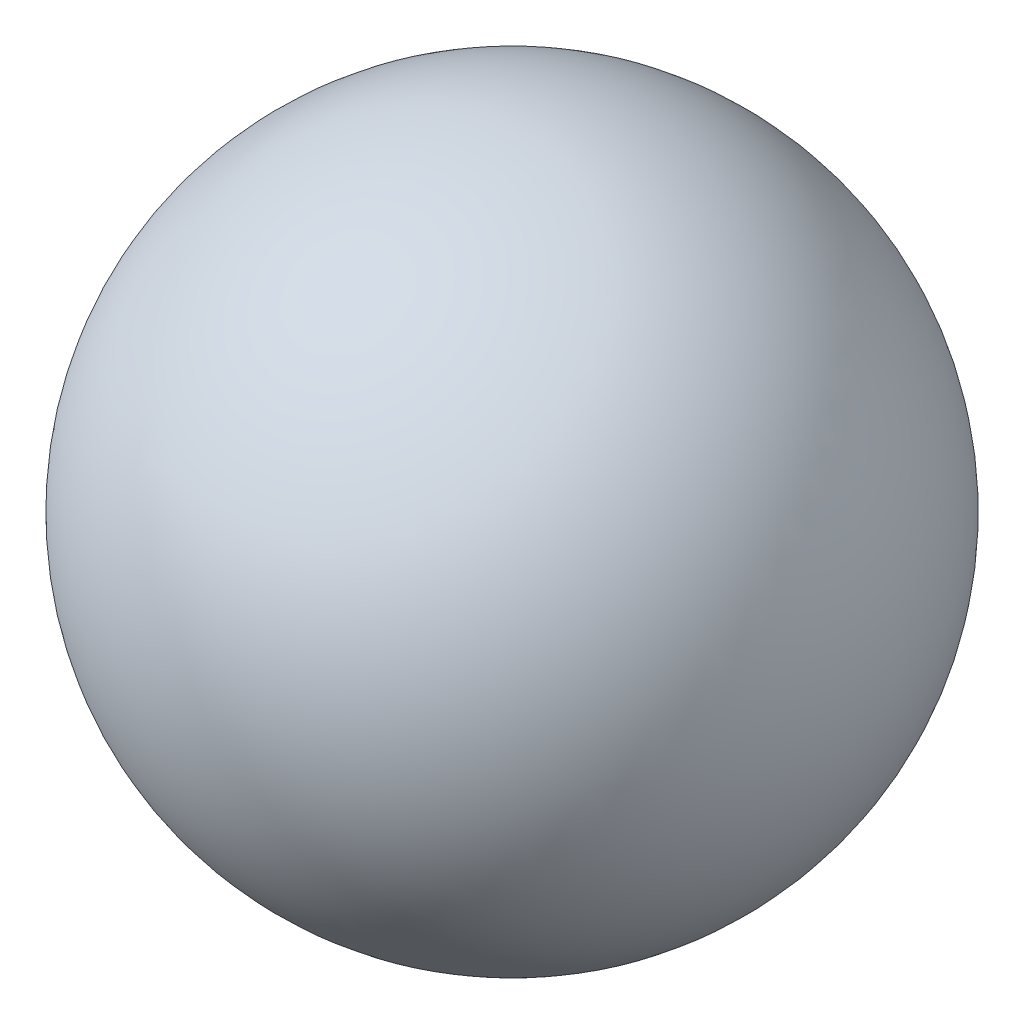
ISO-10303-21;
HEADER;
FILE_DESCRIPTION(('STEP AP214'),'2;1');
FILE_NAME('part.step','',(''),(''),'','','');
FILE_SCHEMA(('AUTOMOTIVE_DESIGN { 1 0 10303 214 1 1 1 1 }'));
ENDSEC;
DATA;
#1=APPLICATION_CONTEXT('core data for automotive mechanical design processes');
#2=APPLICATION_PROTOCOL_DEFINITION('international standard','automotive_design',2000,#1);
#3=PRODUCT_CONTEXT('',#1,'mechanical');
#4=PRODUCT('Part','Part','',(#3));
#5=PRODUCT_RELATED_PRODUCT_CATEGORY('part','',(#4));
#6=PRODUCT_DEFINITION_FORMATION('','',#4);
#7=PRODUCT_DEFINITION_CONTEXT('part definition',#1,'design');
#8=PRODUCT_DEFINITION('design','',#6,#7);
#9=PRODUCT_DEFINITION_SHAPE('','',#8);
#10=(LENGTH_UNIT() NAMED_UNIT(*) SI_UNIT(.MILLI.,.METRE.));
#11=(NAMED_UNIT(*) PLANE_ANGLE_UNIT() SI_UNIT($,.RADIAN.));
#12=(NAMED_UNIT(*) SI_UNIT($,.STERADIAN.) SOLID_ANGLE_UNIT());
#13=UNCERTAINTY_MEASURE_WITH_UNIT(LENGTH_MEASURE(1.E-05),#10,'distance_accuracy_value','');
#14=(GEOMETRIC_REPRESENTATION_CONTEXT(3) GLOBAL_UNCERTAINTY_ASSIGNED_CONTEXT((#13)) GLOBAL_UNIT_ASSIGNED_CONTEXT((#10,
#11,#12)) REPRESENTATION_CONTEXT('',''));
#15=CARTESIAN_POINT('',(0.,0.,0.));
#16=DIRECTION('',(0.,0.,1.));
#17=DIRECTION('',(1.,0.,0.));
#18=AXIS2_PLACEMENT_3D('',#15,#16,#17);
#19=CARTESIAN_POINT('',(0.,0.,0.));
#20=DIRECTION('',(0.,-1.,0.));
#21=DIRECTION('',(0.,0.,1.));
#22=AXIS2_PLACEMENT_3D('',#19,#20,#21);
#23=SPHERICAL_SURFACE('',#22,7.62);
#24=CARTESIAN_POINT('',(0.,-7.62,0.));
#25=VERTEX_POINT('',#24);
#26=VERTEX_LOOP('',#25);
#27=FACE_BOUND('',#26,.T.);
#28=ADVANCED_FACE('F56',(#27),#23,.T.);
#29=CLOSED_SHELL('',(#28));
#30=CARTESIAN_POINT('',(0.,0.,0.));
#31=DIRECTION('',(0.,-1.,0.));
#32=DIRECTION('',(0.,0.,1.));
#33=AXIS2_PLACEMENT_3D('',#30,#31,#32);
#34=SPHERICAL_SURFACE('',#33,7.112);
#35=CARTESIAN_POINT('',(0.,-7.112,0.));
#36=VERTEX_POINT('',#35);
#37=VERTEX_LOOP('',#36);
#38=FACE_BOUND('',#37,.T.);
#39=ADVANCED_FACE('F58',(#38),#34,.F.);
#40=CLOSED_SHELL('',(#39));
#41=ORIENTED_CLOSED_SHELL('',*,#40,.T.);
#42=BREP_WITH_VOIDS('B2_NOT_SHOWN',#29,(#41));
#43=CARTESIAN_POINT('',(0.,-2.54,0.762));
#44=DIRECTION('',(0.,1.,0.));
#45=DIRECTION('',(0.,0.,1.));
#46=AXIS2_PLACEMENT_3D('',#43,#44,#45);
#47=CYLINDRICAL_SURFACE('',#46,0.508);
#48=CARTESIAN_POINT('',(0.381,0.,0.425989583494797));
#49=CARTESIAN_POINT('',(0.380998016385693,-0.0177793455499922,0.425985457287657));
#50=CARTESIAN_POINT('',(0.379740437049454,-0.0355716419147087,0.424544828795337));
#51=CARTESIAN_POINT('',(0.37484896635401,-0.0704417834777279,0.419123764158193));
#52=CARTESIAN_POINT('',(0.371207991554973,-0.0875173370369198,0.415135758077279));
#53=CARTESIAN_POINT('',(0.361908951040885,-0.12028928106961,0.405447175085526));
#54=CARTESIAN_POINT('',(0.356279407956112,-0.136001449290475,0.399770985437304));
#55=CARTESIAN_POINT('',(0.34323186445446,-0.166203745436269,0.387384404241447));
#56=CARTESIAN_POINT('',(0.335814080194199,-0.180694020774003,0.38067413772491));
#57=CARTESIAN_POINT('',(0.317601370947063,-0.211356650231533,0.365309624984769));
#58=CARTESIAN_POINT('',(0.306424517943931,-0.227245655159859,0.356542583430132));
#59=CARTESIAN_POINT('',(0.281771335881912,-0.257181468288185,0.339036242799247));
#60=CARTESIAN_POINT('',(0.268291620631443,-0.271225509024279,0.330297004161761));
#61=CARTESIAN_POINT('',(0.236120988792806,-0.299938119666235,0.311753040750674));
#62=CARTESIAN_POINT('',(0.216928011431707,-0.314148715559471,0.30209510011311));
#63=CARTESIAN_POINT('',(0.175562187575151,-0.338994040891242,0.284777663194245));
#64=CARTESIAN_POINT('',(0.153396516636703,-0.349637171554266,0.27711348137436));
#65=CARTESIAN_POINT('',(0.113758732090228,-0.364034752221311,0.266612982170477));
#66=CARTESIAN_POINT('',(0.0968872966214702,-0.368898702379056,0.263017734262171));
#67=CARTESIAN_POINT('',(0.0623703627668349,-0.376273089462649,0.257541684717085));
#68=CARTESIAN_POINT('',(0.0447255508828906,-0.378785571130973,0.255659393601392));
#69=CARTESIAN_POINT('',(0.00910973352587693,-0.381310320401213,0.253767906032065));
#70=CARTESIAN_POINT('',(-0.00886199881617137,-0.381316091411647,0.253763576654049));
#71=CARTESIAN_POINT('',(-0.0445303037951684,-0.378811044057775,0.255640315482125));
#72=CARTESIAN_POINT('',(-0.0622268117468158,-0.376299642901345,0.257521820308858));
#73=CARTESIAN_POINT('',(-0.0962378552233624,-0.36904141315016,0.262911900021143));
#74=CARTESIAN_POINT('',(-0.112578964132098,-0.364374093097601,0.266362541274884));
#75=CARTESIAN_POINT('',(-0.144190843201706,-0.353061106885794,0.274619012211467));
#76=CARTESIAN_POINT('',(-0.159461379078256,-0.346415009349969,0.279425137379853));
#77=CARTESIAN_POINT('',(-0.19030109815396,-0.330573477752744,0.290674943198136));
#78=CARTESIAN_POINT('',(-0.2057235877185,-0.321179927457477,0.29723958685063));
#79=CARTESIAN_POINT('',(-0.234840081638017,-0.300549639192849,0.311249815696111));
#80=CARTESIAN_POINT('',(-0.248532595289119,-0.289311330525321,0.318696150075661));
#81=CARTESIAN_POINT('',(-0.276626838885245,-0.262833269393384,0.33554983466265));
#82=CARTESIAN_POINT('',(-0.290638212254926,-0.247241260628456,0.345054794011604));
#83=CARTESIAN_POINT('',(-0.315978223890034,-0.213910015784877,0.363916066047089));
#84=CARTESIAN_POINT('',(-0.327305584091586,-0.196169762813958,0.373272305946609));
#85=CARTESIAN_POINT('',(-0.345117944350417,-0.162310604889806,0.389078657693884));
#86=CARTESIAN_POINT('',(-0.352117322071398,-0.146561290254356,0.395738095628522));
#87=CARTESIAN_POINT('',(-0.364031268876597,-0.113775418282747,0.407576676332281));
#88=CARTESIAN_POINT('',(-0.368950549446824,-0.096741874095424,0.412759155676939));
#89=CARTESIAN_POINT('',(-0.375672058749536,-0.065103516265656,0.420014271594327));
#90=CARTESIAN_POINT('',(-0.377898836510346,-0.0506864411534216,0.422499689570818));
#91=CARTESIAN_POINT('',(-0.380674271985221,-0.0214997115807581,0.425613605321422));
#92=CARTESIAN_POINT('',(-0.381225076700835,-0.00673053266147598,0.426244478820458));
#93=CARTESIAN_POINT('',(-0.38060698609076,0.0227276638970744,0.425544313283583));
#94=CARTESIAN_POINT('',(-0.379437457784703,0.0374166500339181,0.424212552114353));
#95=CARTESIAN_POINT('',(-0.375469219270804,0.066313342722231,0.419808104310832));
#96=CARTESIAN_POINT('',(-0.3726677282605,0.0805201838825708,0.416732446381823));
#97=CARTESIAN_POINT('',(-0.36427145729223,0.113369863409316,0.407853493936229));
#98=CARTESIAN_POINT('',(-0.358023642031769,0.131682732273216,0.401460147747217));
#99=CARTESIAN_POINT('',(-0.343125749691697,0.16670214658583,0.387253832918579));
#100=CARTESIAN_POINT('',(-0.334471249544115,0.183405657472732,0.379438259702129));
#101=CARTESIAN_POINT('',(-0.314629226327175,0.215734647960938,0.36294496252353));
#102=CARTESIAN_POINT('',(-0.303362639821486,0.231300750244426,0.354246474110134));
#103=CARTESIAN_POINT('',(-0.278593710076381,0.260604532155394,0.336937333131529));
#104=CARTESIAN_POINT('',(-0.265090280654411,0.274341317615177,0.32832672540717));
#105=CARTESIAN_POINT('',(-0.232723566416461,0.302584355986838,0.309981034870007));
#106=CARTESIAN_POINT('',(-0.213333652795043,0.316604710699709,0.300410437708267));
#107=CARTESIAN_POINT('',(-0.171590109638824,0.341025666266707,0.283329113796563));
#108=CARTESIAN_POINT('',(-0.149243041619269,0.351434101437009,0.275813936407586));
#109=CARTESIAN_POINT('',(-0.109411938016281,0.365363249832121,0.265634707751597));
#110=CARTESIAN_POINT('',(-0.0925195145601238,0.370016225493198,0.262190285808369));
#111=CARTESIAN_POINT('',(-0.0580045741019979,0.376968714260875,0.257021925399977));
#112=CARTESIAN_POINT('',(-0.0403827245590156,0.37927033151299,0.255296448747343));
#113=CARTESIAN_POINT('',(-0.00486349190857812,0.381385163296198,0.253711540539643));
#114=CARTESIAN_POINT('',(0.0130344399171961,0.381192536406543,0.253856489444239));
#115=CARTESIAN_POINT('',(0.0485162888015648,0.378317508209396,0.256009639760459));
#116=CARTESIAN_POINT('',(0.0661001209341674,0.375634443622277,0.258018337545279));
#117=CARTESIAN_POINT('',(0.0999545715547823,0.368052371293544,0.263643361650072));
#118=CARTESIAN_POINT('',(0.116248494073911,0.363219953944332,0.267211325386106));
#119=CARTESIAN_POINT('',(0.147741981146731,0.351589831332783,0.275684689739136));
#120=CARTESIAN_POINT('',(0.162941310740757,0.344791705682946,0.280590376429534));
#121=CARTESIAN_POINT('',(0.193687115486772,0.328605403850626,0.292055188784979));
#122=CARTESIAN_POINT('',(0.209077874125209,0.319011063434666,0.298738664122746));
#123=CARTESIAN_POINT('',(0.23810336217795,0.29797592409923,0.312964814567678));
#124=CARTESIAN_POINT('',(0.251736456745377,0.286533428129343,0.320508277459029));
#125=CARTESIAN_POINT('',(0.27968544687813,0.259586636893559,0.337549863273051));
#126=CARTESIAN_POINT('',(0.293602896516669,0.243726614542264,0.347139456838069));
#127=CARTESIAN_POINT('',(0.318707143710549,0.209837509737431,0.366100150543137));
#128=CARTESIAN_POINT('',(0.32989294081409,0.191807636186711,0.375471169498398));
#129=CARTESIAN_POINT('',(0.347207767105696,0.157763654350063,0.391034012318815));
#130=CARTESIAN_POINT('',(0.353907156898518,0.142154914392537,0.397475392480595));
#131=CARTESIAN_POINT('',(0.36526571099264,0.109706940083803,0.408857285785877));
#132=CARTESIAN_POINT('',(0.369930293102985,0.0928711143347449,0.413801773614801));
#133=CARTESIAN_POINT('',(0.375912526701212,0.0632997922223864,0.420287644606494));
#134=CARTESIAN_POINT('',(0.37781039252826,0.0508083638922446,0.422401669125108));
#135=CARTESIAN_POINT('',(0.380354431244,0.0255467274094287,0.425253669703232));
#136=CARTESIAN_POINT('',(0.381001425477683,0.0127767077602088,0.425992548696336));
#137=CARTESIAN_POINT('',(0.381,0.,0.425989583494797));
#138=B_SPLINE_CURVE_WITH_KNOTS('',3,(#48,#49,#50,#51,#52,#53,#54,#55,#56,#57,#58,#59,#60,#61,
#62,#63,#64,#65,#66,#67,#68,#69,#70,#71,#72,#73,#74,#75,#76,#77,#78,#79,#80,#81,#82,#83,#84,#85,
#86,#87,#88,#89,#90,#91,#92,#93,#94,#95,#96,#97,#98,#99,#100,#101,#102,#103,#104,#105,#106,#107,
#108,#109,#110,#111,#112,#113,#114,#115,#116,#117,#118,#119,#120,#121,#122,#123,#124,#125,#126,
#127,#128,#129,#130,#131,#132,#133,#134,#135,#136,#137),.UNSPECIFIED.,.T.,.F.,(4,2,2,2,2,2,2,2,
2,2,2,2,2,2,2,2,2,2,2,2,2,2,2,2,2,2,2,2,2,2,2,2,2,2,2,2,2,2,2,2,2,2,2,2,4),(0.,
0.0532718712778605,0.106702789536081,0.159396527947515,0.212083900106776,0.275806430073891,
0.339623478821272,0.416470714183362,0.493135684910582,0.546678422205365,0.600174557511981,
0.653809336849004,0.707456536929248,0.759266339973803,0.811087445916395,0.868519584057288,
0.92600087821504,0.994789773700318,1.06361135930612,1.11886850004634,1.17399980233424,
1.2182043340238,1.26235221370422,1.30651634124579,1.3507559438251,1.4115542715713,
1.47246508304065,1.53553975102373,1.59864513753567,1.67551734870037,1.75222176495113,
1.8055663562751,1.85886316953077,1.91228482433791,1.96572071104708,2.01760534417871,
2.06950108160476,2.12727553326487,2.18510334053265,2.25437085460977,2.32366369959092,
2.37799443022898,2.43217960540391,2.47048734260862,2.50876991770357),.UNSPECIFIED.);
#139=CARTESIAN_POINT('',(0.381,0.,0.425989583494797));
#140=VERTEX_POINT('',#139);
#141=EDGE_CURVE('E90',#140,#140,#138,.T.);
#142=ORIENTED_EDGE('',*,*,#141,.T.);
#143=EDGE_LOOP('',(#142));
#144=FACE_BOUND('',#143,.T.);
#145=CARTESIAN_POINT('',(0.,-2.54,0.762));
#146=DIRECTION('',(0.,1.,0.));
#147=DIRECTION('',(0.,0.,1.));
#148=AXIS2_PLACEMENT_3D('',#145,#146,#147);
#149=CIRCLE('',#148,0.508);
#150=CARTESIAN_POINT('',(0.,-2.54,1.27));
#151=VERTEX_POINT('',#150);
#152=EDGE_CURVE('E160',#151,#151,#149,.T.);
#153=ORIENTED_EDGE('',*,*,#152,.F.);
#154=EDGE_LOOP('',(#153));
#155=FACE_BOUND('',#154,.T.);
#156=CARTESIAN_POINT('',(0.,2.54,0.762));
#157=DIRECTION('',(0.,1.,0.));
#158=DIRECTION('',(0.,0.,1.));
#159=AXIS2_PLACEMENT_3D('',#156,#157,#158);
#160=CIRCLE('',#159,0.508);
#161=CARTESIAN_POINT('',(0.,2.54,1.27));
#162=VERTEX_POINT('',#161);
#163=EDGE_CURVE('E153',#162,#162,#160,.T.);
#164=ORIENTED_EDGE('',*,*,#163,.T.);
#165=EDGE_LOOP('',(#164));
#166=FACE_BOUND('',#165,.T.);
#167=ADVANCED_FACE('F85',(#144,#155,#166),#47,.F.);
#168=CARTESIAN_POINT('',(0.,-2.54,0.762));
#169=DIRECTION('',(0.,1.,0.));
#170=DIRECTION('',(0.,0.,1.));
#171=AXIS2_PLACEMENT_3D('',#168,#169,#170);
#172=CYLINDRICAL_SURFACE('',#171,1.016);
#173=CARTESIAN_POINT('',(0.669887952204704,0.,-0.00187573039794095));
#174=CARTESIAN_POINT('',(0.669885652748786,0.0328119002631649,-0.00187967495432026));
#175=CARTESIAN_POINT('',(0.667456393762383,0.0656395457315725,-0.00402910922823274));
#176=CARTESIAN_POINT('',(0.657939449956115,0.130129063537827,-0.0122143279162604));
#177=CARTESIAN_POINT('',(0.650843394143413,0.161788732862866,-0.0182570955388153));
#178=CARTESIAN_POINT('',(0.632542215159404,0.222816146269643,-0.0331620300477917));
#179=CARTESIAN_POINT('',(0.621375903278367,0.252202460274954,-0.0419974654777752));
#180=CARTESIAN_POINT('',(0.595363516149319,0.308640351702697,-0.0614450634919803));
#181=CARTESIAN_POINT('',(0.580516632977858,0.335691414753318,-0.0720576160055716));
#182=CARTESIAN_POINT('',(0.544946975034463,0.391187363191853,-0.0957947847381584));
#183=CARTESIAN_POINT('',(0.523674559137665,0.419221475838521,-0.109056287449955));
#184=CARTESIAN_POINT('',(0.476974078686816,0.471677945586736,-0.135481613945119));
#185=CARTESIAN_POINT('',(0.451542097521344,0.496096856956785,-0.148645333324871));
#186=CARTESIAN_POINT('',(0.392946482017839,0.544029452729934,-0.175564744398488));
#187=CARTESIAN_POINT('',(0.359198879198935,0.566937745647485,-0.18914528371731));
#188=CARTESIAN_POINT('',(0.287260643518706,0.606556852230181,-0.213279928032791));
#189=CARTESIAN_POINT('',(0.249074924675622,0.623274436148369,-0.223837336288321));
#190=CARTESIAN_POINT('',(0.173780516099575,0.648029701855079,-0.239683071695696));
#191=CARTESIAN_POINT('',(0.137017701577611,0.656821457586376,-0.245424176380762));
#192=CARTESIAN_POINT('',(0.0621463680297922,0.668068409055409,-0.252791857510297));
#193=CARTESIAN_POINT('',(0.0240395488312368,0.670531337048318,-0.254423454703583));
#194=CARTESIAN_POINT('',(-0.0462887456566461,0.669071344343661,-0.253462231371501));
#195=CARTESIAN_POINT('',(-0.0785419633663688,0.666044371275519,-0.251462054302684));
#196=CARTESIAN_POINT('',(-0.141968246887437,0.655460347286869,-0.244537759348579));
#197=CARTESIAN_POINT('',(-0.173141232936352,0.647902962599372,-0.239613426033489));
#198=CARTESIAN_POINT('',(-0.233546808468373,0.628656597911136,-0.227273018689681));
#199=CARTESIAN_POINT('',(-0.262784405984759,0.616978819396237,-0.219863702878565));
#200=CARTESIAN_POINT('',(-0.318887955075466,0.589941533736148,-0.203103493782287));
#201=CARTESIAN_POINT('',(-0.345753456037664,0.574581329113944,-0.193752232724183));
#202=CARTESIAN_POINT('',(-0.400111281318657,0.538388275443779,-0.172412432524579));
#203=CARTESIAN_POINT('',(-0.42722907424676,0.51710310895648,-0.160239020038328));
#204=CARTESIAN_POINT('',(-0.477744178594009,0.470835599244853,-0.135114551430338));
#205=CARTESIAN_POINT('',(-0.501135662395335,0.445847580618299,-0.12216232003979));
#206=CARTESIAN_POINT('',(-0.547148549449061,0.38849452315655,-0.09456679722939));
#207=CARTESIAN_POINT('',(-0.569120641112125,0.355585299210041,-0.0799633889424288));
#208=CARTESIAN_POINT('',(-0.6071954411447,0.285725832447353,-0.0529326462614925));
#209=CARTESIAN_POINT('',(-0.62330825914932,0.24878269440911,-0.0405015831286289));
#210=CARTESIAN_POINT('',(-0.645241097226172,0.182394366524883,-0.0228946168361788));
#211=CARTESIAN_POINT('',(-0.652681892138792,0.153767797287837,-0.0166614164117789));
#212=CARTESIAN_POINT('',(-0.663736687501258,0.0953137287428041,-0.00726174653536285));
#213=CARTESIAN_POINT('',(-0.667357072397408,0.0654883197532852,-0.00409016144888624));
#214=CARTESIAN_POINT('',(-0.670545866655927,0.00532982224020018,-0.00130178719098621));
#215=CARTESIAN_POINT('',(-0.670098344968776,-0.0250047975190028,-0.00169897425032314));
#216=CARTESIAN_POINT('',(-0.665145938826073,-0.0850959691655953,-0.00601467415993897));
#217=CARTESIAN_POINT('',(-0.660637708214493,-0.114852023634216,-0.0099360910841049));
#218=CARTESIAN_POINT('',(-0.648130178740439,-0.171727014118133,-0.0204611859783174));
#219=CARTESIAN_POINT('',(-0.640287520485526,-0.198904284303581,-0.0269436857745979));
#220=CARTESIAN_POINT('',(-0.621481594659937,-0.251582313560835,-0.0418408891711478));
#221=CARTESIAN_POINT('',(-0.610517293170319,-0.277082513720111,-0.0502562327695094));
#222=CARTESIAN_POINT('',(-0.583281455688916,-0.331090272053187,-0.0700909107101534));
#223=CARTESIAN_POINT('',(-0.566387941957747,-0.359186193095913,-0.0817747702226569));
#224=CARTESIAN_POINT('',(-0.528850900117142,-0.41246875305288,-0.105796403945251));
#225=CARTESIAN_POINT('',(-0.508202810730758,-0.437651791668381,-0.118134960463916));
#226=CARTESIAN_POINT('',(-0.458730063766668,-0.489756387419994,-0.145067498651922));
#227=CARTESIAN_POINT('',(-0.429097876914155,-0.515952655956067,-0.159597655395711));
#228=CARTESIAN_POINT('',(-0.365118974233617,-0.563037184290615,-0.186761561159213));
#229=CARTESIAN_POINT('',(-0.330776788309964,-0.583930489901106,-0.199397108193796));
#230=CARTESIAN_POINT('',(-0.265159119822072,-0.616037116805294,-0.219265715310444));
#231=CARTESIAN_POINT('',(-0.234592873111785,-0.628343771508858,-0.227071856907626));
#232=CARTESIAN_POINT('',(-0.171458925533324,-0.64841831067769,-0.239944451739798));
#233=CARTESIAN_POINT('',(-0.1388929242014,-0.656189991867002,-0.245013196484465));
#234=CARTESIAN_POINT('',(-0.0724849274391327,-0.666806187916623,-0.251962660859596));
#235=CARTESIAN_POINT('',(-0.0386382620282689,-0.66963044076771,-0.253830269687726));
#236=CARTESIAN_POINT('',(0.0291095187510443,-0.670111578102018,-0.254147388432272));
#237=CARTESIAN_POINT('',(0.0630106318291387,-0.667768674533851,-0.252597038547968));
#238=CARTESIAN_POINT('',(0.127522394472751,-0.658391758815617,-0.246451622764028));
#239=CARTESIAN_POINT('',(0.158201621145386,-0.651681368967301,-0.242066733033447));
#240=CARTESIAN_POINT('',(0.217901195022971,-0.634221483483566,-0.230823517316735));
#241=CARTESIAN_POINT('',(0.24692128043891,-0.623471352449529,-0.223964802236954));
#242=CARTESIAN_POINT('',(0.30452888788478,-0.597555267901963,-0.207778056275466));
#243=CARTESIAN_POINT('',(0.332973046203416,-0.582153089154179,-0.198321316035285));
#244=CARTESIAN_POINT('',(0.38697785999739,-0.547745210910149,-0.177861489530849));
#245=CARTESIAN_POINT('',(0.412536621006785,-0.528737165606684,-0.166857397845098));
#246=CARTESIAN_POINT('',(0.464273833947673,-0.484291778365416,-0.142239576552327));
#247=CARTESIAN_POINT('',(0.489922037928234,-0.458313721400878,-0.128487093813137));
#248=CARTESIAN_POINT('',(0.536723117276297,-0.402499382770745,-0.101087462774017));
#249=CARTESIAN_POINT('',(0.557873117874746,-0.372660653249628,-0.0874403871751797));
#250=CARTESIAN_POINT('',(0.59346513748715,-0.312490567073566,-0.0629099238673311));
#251=CARTESIAN_POINT('',(0.608357071088895,-0.282483542074274,-0.0518869479475567));
#252=CARTESIAN_POINT('',(0.633663483423455,-0.219895236116029,-0.0323446695825107));
#253=CARTESIAN_POINT('',(0.644087595144593,-0.18731967464761,-0.023819993286731));
#254=CARTESIAN_POINT('',(0.657868288107099,-0.128891371844105,-0.0122895223903415));
#255=CARTESIAN_POINT('',(0.662354741962692,-0.103474419228182,-0.00842708044526302));
#256=CARTESIAN_POINT('',(0.668364726324926,-0.0520414035845703,-0.00321926539399128));
#257=CARTESIAN_POINT('',(0.669889776080957,-0.026025654684663,-0.00187260166533513));
#258=CARTESIAN_POINT('',(0.669887952204704,0.,-0.00187573039794095));
#259=B_SPLINE_CURVE_WITH_KNOTS('',3,(#173,#174,#175,#176,#177,#178,#179,#180,#181,#182,#183,
#184,#185,#186,#187,#188,#189,#190,#191,#192,#193,#194,#195,#196,#197,#198,#199,#200,#201,#202,
#203,#204,#205,#206,#207,#208,#209,#210,#211,#212,#213,#214,#215,#216,#217,#218,#219,#220,#221,
#222,#223,#224,#225,#226,#227,#228,#229,#230,#231,#232,#233,#234,#235,#236,#237,#238,#239,#240,
#241,#242,#243,#244,#245,#246,#247,#248,#249,#250,#251,#252,#253,#254,#255,#256,#257,#258),
.UNSPECIFIED.,.T.,.F.,(4,2,2,2,2,2,2,2,2,2,2,2,2,2,2,2,2,2,2,2,2,2,2,2,2,2,2,2,2,2,2,2,2,2,2,2,
2,2,2,2,2,2,4),(0.,0.0983171784046264,0.196811194456812,0.294389605721487,0.391989455452076,
0.504390796104421,0.616898588731649,0.745158185026731,0.873277097521223,0.987262739223644,
1.10110905243293,1.19800967466508,1.29491743669091,1.39156375481505,1.48822839290392,
1.59748967041645,1.70692018002073,1.8328702290881,1.95860192013917,2.04892279487233,
2.13909249043244,2.22961546718808,2.32021310612709,2.40695737066323,2.4937303992428,
2.59777451570126,2.70194588589866,2.82775365554823,2.95344126549052,3.05460298597788,
3.15567989092031,3.25716979318609,3.35865553257346,3.45336604725929,3.54809146491358,
3.64880612763354,3.74958653667395,3.86615597565744,3.98279969093371,4.08820731669258,
4.19338651756993,4.27140951003211,4.34939246482007),.UNSPECIFIED.);
#260=CARTESIAN_POINT('',(0.669887952204704,0.,-0.00187573039794095));
#261=VERTEX_POINT('',#260);
#262=EDGE_CURVE('E54',#261,#261,#259,.T.);
#263=ORIENTED_EDGE('',*,*,#262,.T.);
#264=EDGE_LOOP('',(#263));
#265=FACE_BOUND('',#264,.T.);
#266=CARTESIAN_POINT('',(0.,-2.54,0.762));
#267=DIRECTION('',(0.,1.,0.));
#268=DIRECTION('',(0.,0.,1.));
#269=AXIS2_PLACEMENT_3D('',#266,#267,#268);
#270=CIRCLE('',#269,1.016);
#271=CARTESIAN_POINT('',(0.,-2.54,1.778));
#272=VERTEX_POINT('',#271);
#273=EDGE_CURVE('E103',#272,#272,#270,.T.);
#274=ORIENTED_EDGE('',*,*,#273,.T.);
#275=EDGE_LOOP('',(#274));
#276=FACE_BOUND('',#275,.T.);
#277=CARTESIAN_POINT('',(0.,2.54,0.762));
#278=DIRECTION('',(0.,1.,0.));
#279=DIRECTION('',(0.,0.,1.));
#280=AXIS2_PLACEMENT_3D('',#277,#278,#279);
#281=CIRCLE('',#280,1.016);
#282=CARTESIAN_POINT('',(0.,2.54,1.778));
#283=VERTEX_POINT('',#282);
#284=EDGE_CURVE('E157',#283,#283,#281,.T.);
#285=ORIENTED_EDGE('',*,*,#284,.F.);
#286=EDGE_LOOP('',(#285));
#287=FACE_BOUND('',#286,.T.);
#288=ADVANCED_FACE('F110',(#265,#276,#287),#172,.T.);
#289=CARTESIAN_POINT('',(0.,-2.54,0.));
#290=DIRECTION('',(0.,1.,0.));
#291=DIRECTION('',(0.,0.,1.));
#292=AXIS2_PLACEMENT_3D('',#289,#290,#291);
#293=PLANE('',#292);
#294=ORIENTED_EDGE('',*,*,#152,.T.);
#295=EDGE_LOOP('',(#294));
#296=FACE_BOUND('',#295,.T.);
#297=ORIENTED_EDGE('',*,*,#273,.F.);
#298=EDGE_LOOP('',(#297));
#299=FACE_BOUND('',#298,.T.);
#300=ADVANCED_FACE('F114',(#296,#299),#293,.F.);
#301=CARTESIAN_POINT('',(0.,2.54,0.));
#302=DIRECTION('',(0.,1.,0.));
#303=DIRECTION('',(0.,0.,1.));
#304=AXIS2_PLACEMENT_3D('',#301,#302,#303);
#305=PLANE('',#304);
#306=ORIENTED_EDGE('',*,*,#163,.F.);
#307=EDGE_LOOP('',(#306));
#308=FACE_BOUND('',#307,.T.);
#309=ORIENTED_EDGE('',*,*,#284,.T.);
#310=EDGE_LOOP('',(#309));
#311=FACE_BOUND('',#310,.T.);
#312=ADVANCED_FACE('F121',(#308,#311),#305,.T.);
#313=CARTESIAN_POINT('',(0.,0.,-2.54));
#314=DIRECTION('',(0.,0.,1.));
#315=DIRECTION('',(1.,0.,0.));
#316=AXIS2_PLACEMENT_3D('',#313,#314,#315);
#317=PLANE('',#316);
#318=CARTESIAN_POINT('',(0.,0.,-2.54));
#319=DIRECTION('',(0.,0.,1.));
#320=DIRECTION('',(1.,0.,0.));
#321=AXIS2_PLACEMENT_3D('',#318,#319,#320);
#322=CIRCLE('',#321,0.669887952204704);
#323=CARTESIAN_POINT('',(0.669887952204704,0.,-2.54));
#324=VERTEX_POINT('',#323);
#325=EDGE_CURVE('E99',#324,#324,#322,.T.);
#326=ORIENTED_EDGE('',*,*,#325,.F.);
#327=EDGE_LOOP('',(#326));
#328=FACE_BOUND('',#327,.T.);
#329=ADVANCED_FACE('F119',(#328),#317,.F.);
#330=CARTESIAN_POINT('',(0.,0.,-2.54));
#331=DIRECTION('',(0.,0.,1.));
#332=DIRECTION('',(1.,0.,0.));
#333=AXIS2_PLACEMENT_3D('',#330,#331,#332);
#334=CYLINDRICAL_SURFACE('',#333,0.669887952204704);
#335=ORIENTED_EDGE('',*,*,#262,.F.);
#336=EDGE_LOOP('',(#335));
#337=FACE_BOUND('',#336,.T.);
#338=ORIENTED_EDGE('',*,*,#325,.T.);
#339=EDGE_LOOP('',(#338));
#340=FACE_BOUND('',#339,.T.);
#341=ADVANCED_FACE('F87',(#337,#340),#334,.T.);
#342=CARTESIAN_POINT('',(0.,0.,-2.0066));
#343=DIRECTION('',(0.,0.,1.));
#344=DIRECTION('',(1.,0.,0.));
#345=AXIS2_PLACEMENT_3D('',#342,#343,#344);
#346=CYLINDRICAL_SURFACE('',#345,0.381);
#347=ORIENTED_EDGE('',*,*,#141,.F.);
#348=EDGE_LOOP('',(#347));
#349=FACE_BOUND('',#348,.T.);
#350=CARTESIAN_POINT('',(0.,0.,-2.032));
#351=DIRECTION('',(0.,0.,1.));
#352=DIRECTION('',(1.,0.,0.));
#353=AXIS2_PLACEMENT_3D('',#350,#351,#352);
#354=CIRCLE('',#353,0.381);
#355=CARTESIAN_POINT('',(0.381,0.,-2.032));
#356=VERTEX_POINT('',#355);
#357=EDGE_CURVE('E149',#356,#356,#354,.T.);
#358=ORIENTED_EDGE('',*,*,#357,.F.);
#359=EDGE_LOOP('',(#358));
#360=FACE_BOUND('',#359,.T.);
#361=ADVANCED_FACE('F127',(#349,#360),#346,.F.);
#362=CARTESIAN_POINT('',(0.,0.,-2.032));
#363=DIRECTION('',(0.,0.,1.));
#364=DIRECTION('',(1.,0.,0.));
#365=AXIS2_PLACEMENT_3D('',#362,#363,#364);
#366=PLANE('',#365);
#367=ORIENTED_EDGE('',*,*,#357,.T.);
#368=EDGE_LOOP('',(#367));
#369=FACE_BOUND('',#368,.T.);
#370=ADVANCED_FACE('F142',(#369),#366,.T.);
#371=CLOSED_SHELL('',(#167,#288,#300,#312,#329,#341,#361,#370));
#372=MANIFOLD_SOLID_BREP('B6',#371);
#373=ADVANCED_BREP_SHAPE_REPRESENTATION('',(#18,#42,#372),#14);
#374=SHAPE_DEFINITION_REPRESENTATION(#9,#373);
ENDSEC;
END-ISO-10303-21;
